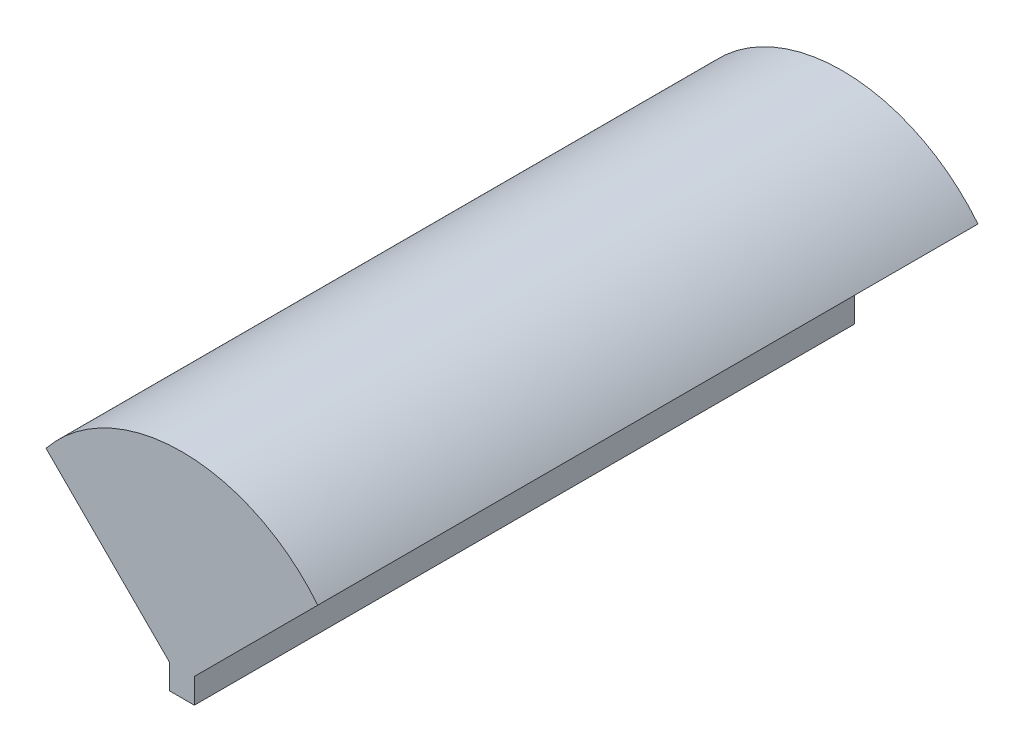
ISO-10303-21;
HEADER;
FILE_DESCRIPTION(('STEP AP214'),'2;1');
FILE_NAME('part.step','',(''),(''),'','','');
FILE_SCHEMA(('AUTOMOTIVE_DESIGN { 1 0 10303 214 1 1 1 1 }'));
ENDSEC;
DATA;
#1=APPLICATION_CONTEXT('core data for automotive mechanical design processes');
#2=APPLICATION_PROTOCOL_DEFINITION('international standard','automotive_design',2000,#1);
#3=PRODUCT_CONTEXT('',#1,'mechanical');
#4=PRODUCT('Part','Part','',(#3));
#5=PRODUCT_RELATED_PRODUCT_CATEGORY('part','',(#4));
#6=PRODUCT_DEFINITION_FORMATION('','',#4);
#7=PRODUCT_DEFINITION_CONTEXT('part definition',#1,'design');
#8=PRODUCT_DEFINITION('design','',#6,#7);
#9=PRODUCT_DEFINITION_SHAPE('','',#8);
#10=(LENGTH_UNIT() NAMED_UNIT(*) SI_UNIT(.MILLI.,.METRE.));
#11=(NAMED_UNIT(*) PLANE_ANGLE_UNIT() SI_UNIT($,.RADIAN.));
#12=(NAMED_UNIT(*) SI_UNIT($,.STERADIAN.) SOLID_ANGLE_UNIT());
#13=UNCERTAINTY_MEASURE_WITH_UNIT(LENGTH_MEASURE(1.E-05),#10,'distance_accuracy_value','');
#14=(GEOMETRIC_REPRESENTATION_CONTEXT(3) GLOBAL_UNCERTAINTY_ASSIGNED_CONTEXT((#13)) GLOBAL_UNIT_ASSIGNED_CONTEXT((#10,
#11,#12)) REPRESENTATION_CONTEXT('',''));
#15=CARTESIAN_POINT('',(0.,0.,0.));
#16=DIRECTION('',(0.,0.,1.));
#17=DIRECTION('',(1.,0.,0.));
#18=AXIS2_PLACEMENT_3D('',#15,#16,#17);
#19=CARTESIAN_POINT('',(0.,0.,52.96));
#20=DIRECTION('',(0.,1.,0.));
#21=DIRECTION('',(0.,0.,1.));
#22=AXIS2_PLACEMENT_3D('',#19,#20,#21);
#23=PLANE('',#22);
#24=DIRECTION('',(1.,0.,0.));
#25=VECTOR('',#24,1.);
#26=CARTESIAN_POINT('',(0.,0.,0.));
#27=LINE('',#26,#25);
#28=CARTESIAN_POINT('',(0.,0.,0.));
#29=VERTEX_POINT('',#28);
#30=CARTESIAN_POINT('',(2.,0.,0.));
#31=VERTEX_POINT('',#30);
#32=EDGE_CURVE('E132',#29,#31,#27,.T.);
#33=ORIENTED_EDGE('',*,*,#32,.T.);
#34=DIRECTION('',(0.,0.,-1.));
#35=VECTOR('',#34,1.);
#36=CARTESIAN_POINT('',(2.,0.,52.96));
#37=LINE('',#36,#35);
#38=CARTESIAN_POINT('',(2.,0.,52.96));
#39=VERTEX_POINT('',#38);
#40=EDGE_CURVE('E11',#39,#31,#37,.T.);
#41=ORIENTED_EDGE('',*,*,#40,.F.);
#42=DIRECTION('',(1.,0.,0.));
#43=VECTOR('',#42,1.);
#44=CARTESIAN_POINT('',(0.,0.,52.96));
#45=LINE('',#44,#43);
#46=CARTESIAN_POINT('',(0.,0.,52.96));
#47=VERTEX_POINT('',#46);
#48=EDGE_CURVE('E148',#47,#39,#45,.T.);
#49=ORIENTED_EDGE('',*,*,#48,.F.);
#50=DIRECTION('',(0.,0.,-1.));
#51=VECTOR('',#50,1.);
#52=CARTESIAN_POINT('',(0.,0.,52.96));
#53=LINE('',#52,#51);
#54=EDGE_CURVE('E128',#47,#29,#53,.T.);
#55=ORIENTED_EDGE('',*,*,#54,.T.);
#56=EDGE_LOOP('',(#33,#41,#49,#55));
#57=FACE_BOUND('',#56,.T.);
#58=ADVANCED_FACE('F43',(#57),#23,.F.);
#59=CARTESIAN_POINT('',(2.,0.,52.96));
#60=DIRECTION('',(-1.,0.,0.));
#61=DIRECTION('',(0.,0.,1.));
#62=AXIS2_PLACEMENT_3D('',#59,#60,#61);
#63=PLANE('',#62);
#64=DIRECTION('',(0.,1.,0.));
#65=VECTOR('',#64,1.);
#66=CARTESIAN_POINT('',(2.,0.,0.));
#67=LINE('',#66,#65);
#68=CARTESIAN_POINT('',(2.,2.,0.));
#69=VERTEX_POINT('',#68);
#70=EDGE_CURVE('E136',#31,#69,#67,.T.);
#71=ORIENTED_EDGE('',*,*,#70,.T.);
#72=DIRECTION('',(0.,0.,-1.));
#73=VECTOR('',#72,1.);
#74=CARTESIAN_POINT('',(2.,2.,52.96));
#75=LINE('',#74,#73);
#76=CARTESIAN_POINT('',(2.,2.,52.96));
#77=VERTEX_POINT('',#76);
#78=EDGE_CURVE('E52',#77,#69,#75,.T.);
#79=ORIENTED_EDGE('',*,*,#78,.F.);
#80=DIRECTION('',(0.,1.,0.));
#81=VECTOR('',#80,1.);
#82=CARTESIAN_POINT('',(2.,0.,52.96));
#83=LINE('',#82,#81);
#84=EDGE_CURVE('E97',#39,#77,#83,.T.);
#85=ORIENTED_EDGE('',*,*,#84,.F.);
#86=ORIENTED_EDGE('',*,*,#40,.T.);
#87=EDGE_LOOP('',(#71,#79,#85,#86));
#88=FACE_BOUND('',#87,.T.);
#89=ADVANCED_FACE('F176',(#88),#63,.F.);
#90=CARTESIAN_POINT('',(2.,2.,52.96));
#91=DIRECTION('',(-0.707106781186546,0.707106781186549,0.));
#92=DIRECTION('',(-0.707106781186549,-0.707106781186546,0.));
#93=AXIS2_PLACEMENT_3D('',#90,#91,#92);
#94=PLANE('',#93);
#95=DIRECTION('',(0.707106781186549,0.707106781186546,0.));
#96=VECTOR('',#95,1.);
#97=CARTESIAN_POINT('',(2.,2.,0.));
#98=LINE('',#97,#96);
#99=CARTESIAN_POINT('',(11.8994949366117,11.8994949366116,0.));
#100=VERTEX_POINT('',#99);
#101=EDGE_CURVE('E139',#69,#100,#98,.T.);
#102=ORIENTED_EDGE('',*,*,#101,.T.);
#103=DIRECTION('',(0.,0.,-1.));
#104=VECTOR('',#103,1.);
#105=CARTESIAN_POINT('',(11.8994949366117,11.8994949366116,52.96));
#106=LINE('',#105,#104);
#107=CARTESIAN_POINT('',(11.8994949366117,11.8994949366116,52.96));
#108=VERTEX_POINT('',#107);
#109=EDGE_CURVE('E121',#108,#100,#106,.T.);
#110=ORIENTED_EDGE('',*,*,#109,.F.);
#111=DIRECTION('',(0.707106781186549,0.707106781186546,0.));
#112=VECTOR('',#111,1.);
#113=CARTESIAN_POINT('',(2.,2.,52.96));
#114=LINE('',#113,#112);
#115=EDGE_CURVE('E110',#77,#108,#114,.T.);
#116=ORIENTED_EDGE('',*,*,#115,.F.);
#117=ORIENTED_EDGE('',*,*,#78,.T.);
#118=EDGE_LOOP('',(#102,#110,#116,#117));
#119=FACE_BOUND('',#118,.T.);
#120=ADVANCED_FACE('F158',(#119),#94,.F.);
#121=CARTESIAN_POINT('',(0.999999999999999,3.11308439949376,52.96));
#122=DIRECTION('',(0.,0.,-1.));
#123=DIRECTION('',(-1.,0.,0.));
#124=AXIS2_PLACEMENT_3D('',#121,#122,#123);
#125=CYLINDRICAL_SURFACE('',#124,14.);
#126=CARTESIAN_POINT('',(0.999999999999999,3.11308439949376,0.));
#127=DIRECTION('',(0.,0.,1.));
#128=DIRECTION('',(-1.,0.,0.));
#129=AXIS2_PLACEMENT_3D('',#126,#127,#128);
#130=CIRCLE('',#129,14.);
#131=CARTESIAN_POINT('',(-9.89949493661168,11.8994949366116,0.));
#132=VERTEX_POINT('',#131);
#133=EDGE_CURVE('E119',#100,#132,#130,.T.);
#134=ORIENTED_EDGE('',*,*,#133,.T.);
#135=DIRECTION('',(0.,0.,-1.));
#136=VECTOR('',#135,1.);
#137=CARTESIAN_POINT('',(-9.89949493661168,11.8994949366116,52.96));
#138=LINE('',#137,#136);
#139=CARTESIAN_POINT('',(-9.89949493661168,11.8994949366116,52.96));
#140=VERTEX_POINT('',#139);
#141=EDGE_CURVE('E116',#140,#132,#138,.T.);
#142=ORIENTED_EDGE('',*,*,#141,.F.);
#143=CARTESIAN_POINT('',(0.999999999999999,3.11308439949376,52.96));
#144=DIRECTION('',(0.,0.,1.));
#145=DIRECTION('',(-1.,0.,0.));
#146=AXIS2_PLACEMENT_3D('',#143,#144,#145);
#147=CIRCLE('',#146,14.);
#148=EDGE_CURVE('E104',#108,#140,#147,.T.);
#149=ORIENTED_EDGE('',*,*,#148,.F.);
#150=ORIENTED_EDGE('',*,*,#109,.T.);
#151=EDGE_LOOP('',(#134,#142,#149,#150));
#152=FACE_BOUND('',#151,.T.);
#153=ADVANCED_FACE('F117',(#152),#125,.T.);
#154=CARTESIAN_POINT('',(0.,2.,52.96));
#155=DIRECTION('',(0.707106781186546,0.707106781186549,0.));
#156=DIRECTION('',(-0.707106781186549,0.707106781186546,0.));
#157=AXIS2_PLACEMENT_3D('',#154,#155,#156);
#158=PLANE('',#157);
#159=DIRECTION('',(0.707106781186549,-0.707106781186546,0.));
#160=VECTOR('',#159,1.);
#161=CARTESIAN_POINT('',(0.,2.,0.));
#162=LINE('',#161,#160);
#163=CARTESIAN_POINT('',(0.,2.,0.));
#164=VERTEX_POINT('',#163);
#165=EDGE_CURVE('E83',#132,#164,#162,.T.);
#166=ORIENTED_EDGE('',*,*,#165,.T.);
#167=DIRECTION('',(0.,0.,-1.));
#168=VECTOR('',#167,1.);
#169=CARTESIAN_POINT('',(0.,2.,52.96));
#170=LINE('',#169,#168);
#171=CARTESIAN_POINT('',(0.,2.,52.96));
#172=VERTEX_POINT('',#171);
#173=EDGE_CURVE('E122',#172,#164,#170,.T.);
#174=ORIENTED_EDGE('',*,*,#173,.F.);
#175=DIRECTION('',(0.707106781186549,-0.707106781186546,0.));
#176=VECTOR('',#175,1.);
#177=CARTESIAN_POINT('',(0.,2.,52.96));
#178=LINE('',#177,#176);
#179=EDGE_CURVE('E108',#140,#172,#178,.T.);
#180=ORIENTED_EDGE('',*,*,#179,.F.);
#181=ORIENTED_EDGE('',*,*,#141,.T.);
#182=EDGE_LOOP('',(#166,#174,#180,#181));
#183=FACE_BOUND('',#182,.T.);
#184=ADVANCED_FACE('F124',(#183),#158,.F.);
#185=CARTESIAN_POINT('',(0.,0.,52.96));
#186=DIRECTION('',(1.,0.,0.));
#187=DIRECTION('',(0.,0.,-1.));
#188=AXIS2_PLACEMENT_3D('',#185,#186,#187);
#189=PLANE('',#188);
#190=DIRECTION('',(0.,-1.,0.));
#191=VECTOR('',#190,1.);
#192=CARTESIAN_POINT('',(0.,0.,0.));
#193=LINE('',#192,#191);
#194=EDGE_CURVE('E89',#164,#29,#193,.T.);
#195=ORIENTED_EDGE('',*,*,#194,.T.);
#196=ORIENTED_EDGE('',*,*,#54,.F.);
#197=DIRECTION('',(0.,-1.,0.));
#198=VECTOR('',#197,1.);
#199=CARTESIAN_POINT('',(0.,0.,52.96));
#200=LINE('',#199,#198);
#201=EDGE_CURVE('E60',#172,#47,#200,.T.);
#202=ORIENTED_EDGE('',*,*,#201,.F.);
#203=ORIENTED_EDGE('',*,*,#173,.T.);
#204=EDGE_LOOP('',(#195,#196,#202,#203));
#205=FACE_BOUND('',#204,.T.);
#206=ADVANCED_FACE('F165',(#205),#189,.F.);
#207=CARTESIAN_POINT('',(0.999999999999999,3.11308439949376,52.96));
#208=DIRECTION('',(0.,0.,-1.));
#209=DIRECTION('',(-1.,0.,0.));
#210=AXIS2_PLACEMENT_3D('',#207,#208,#209);
#211=PLANE('',#210);
#212=ORIENTED_EDGE('',*,*,#48,.T.);
#213=ORIENTED_EDGE('',*,*,#84,.T.);
#214=ORIENTED_EDGE('',*,*,#115,.T.);
#215=ORIENTED_EDGE('',*,*,#148,.T.);
#216=ORIENTED_EDGE('',*,*,#179,.T.);
#217=ORIENTED_EDGE('',*,*,#201,.T.);
#218=EDGE_LOOP('',(#212,#213,#214,#215,#216,#217));
#219=FACE_BOUND('',#218,.T.);
#220=ADVANCED_FACE('F106',(#219),#211,.F.);
#221=CARTESIAN_POINT('',(0.999999999999999,3.11308439949376,0.));
#222=DIRECTION('',(0.,0.,-1.));
#223=DIRECTION('',(-1.,0.,0.));
#224=AXIS2_PLACEMENT_3D('',#221,#222,#223);
#225=PLANE('',#224);
#226=ORIENTED_EDGE('',*,*,#32,.F.);
#227=ORIENTED_EDGE('',*,*,#194,.F.);
#228=ORIENTED_EDGE('',*,*,#165,.F.);
#229=ORIENTED_EDGE('',*,*,#133,.F.);
#230=ORIENTED_EDGE('',*,*,#101,.F.);
#231=ORIENTED_EDGE('',*,*,#70,.F.);
#232=EDGE_LOOP('',(#226,#227,#228,#229,#230,#231));
#233=FACE_BOUND('',#232,.T.);
#234=ADVANCED_FACE('F161',(#233),#225,.T.);
#235=CLOSED_SHELL('',(#58,#89,#120,#153,#184,#206,#220,#234));
#236=MANIFOLD_SOLID_BREP('B2',#235);
#237=ADVANCED_BREP_SHAPE_REPRESENTATION('',(#18,#236),#14);
#238=SHAPE_DEFINITION_REPRESENTATION(#9,#237);
ENDSEC;
END-ISO-10303-21;
